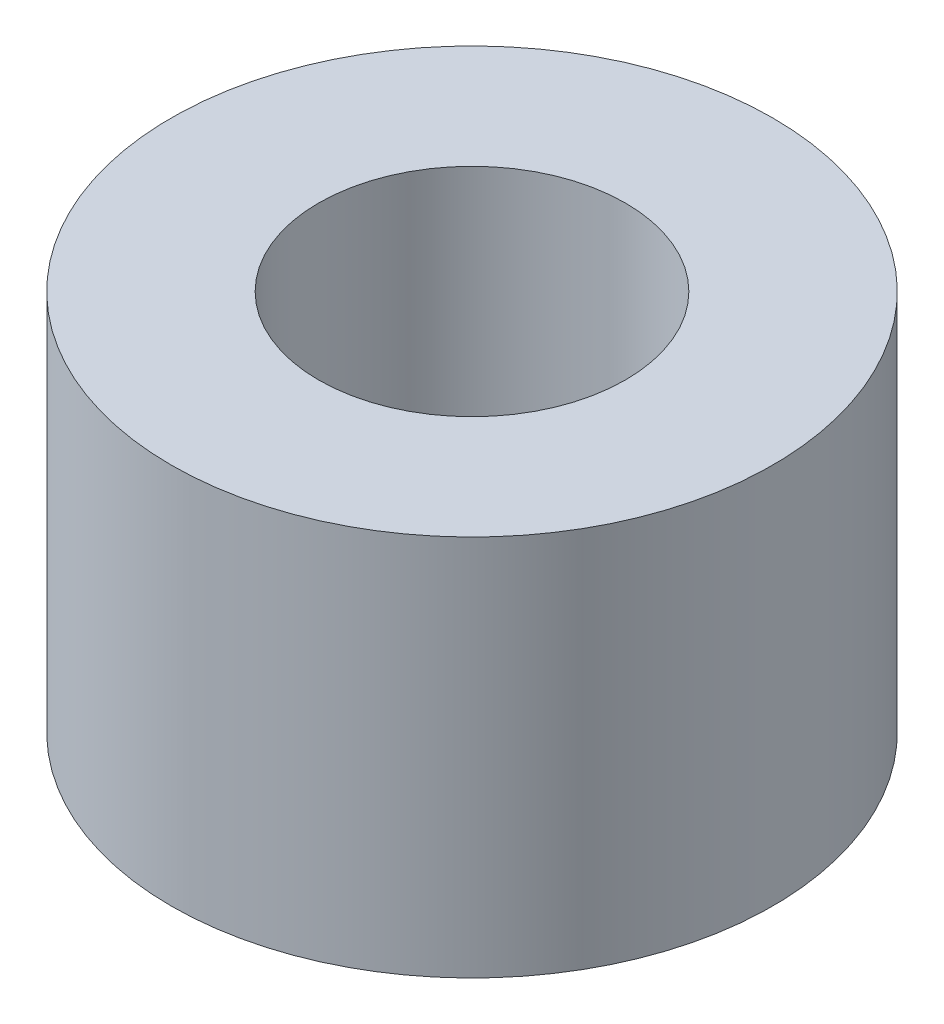
ISO-10303-21;
HEADER;
FILE_DESCRIPTION(('STEP AP214'),'2;1');
FILE_NAME('part.step','',(''),(''),'','','');
FILE_SCHEMA(('AUTOMOTIVE_DESIGN { 1 0 10303 214 1 1 1 1 }'));
ENDSEC;
DATA;
#1=APPLICATION_CONTEXT('core data for automotive mechanical design processes');
#2=APPLICATION_PROTOCOL_DEFINITION('international standard','automotive_design',2000,#1);
#3=PRODUCT_CONTEXT('',#1,'mechanical');
#4=PRODUCT('Part','Part','',(#3));
#5=PRODUCT_RELATED_PRODUCT_CATEGORY('part','',(#4));
#6=PRODUCT_DEFINITION_FORMATION('','',#4);
#7=PRODUCT_DEFINITION_CONTEXT('part definition',#1,'design');
#8=PRODUCT_DEFINITION('design','',#6,#7);
#9=PRODUCT_DEFINITION_SHAPE('','',#8);
#10=(LENGTH_UNIT() NAMED_UNIT(*) SI_UNIT(.MILLI.,.METRE.));
#11=(NAMED_UNIT(*) PLANE_ANGLE_UNIT() SI_UNIT($,.RADIAN.));
#12=(NAMED_UNIT(*) SI_UNIT($,.STERADIAN.) SOLID_ANGLE_UNIT());
#13=UNCERTAINTY_MEASURE_WITH_UNIT(LENGTH_MEASURE(1.E-05),#10,'distance_accuracy_value','');
#14=(GEOMETRIC_REPRESENTATION_CONTEXT(3) GLOBAL_UNCERTAINTY_ASSIGNED_CONTEXT((#13)) GLOBAL_UNIT_ASSIGNED_CONTEXT((#10,
#11,#12)) REPRESENTATION_CONTEXT('',''));
#15=CARTESIAN_POINT('',(0.,0.,0.));
#16=DIRECTION('',(0.,0.,1.));
#17=DIRECTION('',(1.,0.,0.));
#18=AXIS2_PLACEMENT_3D('',#15,#16,#17);
#19=CARTESIAN_POINT('',(0.,6.35,0.));
#20=DIRECTION('',(0.,1.,0.));
#21=DIRECTION('',(0.,0.,1.));
#22=AXIS2_PLACEMENT_3D('',#19,#20,#21);
#23=PLANE('',#22);
#24=CARTESIAN_POINT('',(0.,6.35,0.));
#25=DIRECTION('',(0.,1.,0.));
#26=DIRECTION('',(0.,0.,1.));
#27=AXIS2_PLACEMENT_3D('',#24,#25,#26);
#28=CIRCLE('',#27,5.);
#29=CARTESIAN_POINT('',(0.,6.35,5.));
#30=VERTEX_POINT('',#29);
#31=EDGE_CURVE('E10',#30,#30,#28,.T.);
#32=ORIENTED_EDGE('',*,*,#31,.T.);
#33=EDGE_LOOP('',(#32));
#34=FACE_BOUND('',#33,.T.);
#35=CARTESIAN_POINT('',(0.,6.35,0.));
#36=DIRECTION('',(0.,1.,0.));
#37=DIRECTION('',(0.,0.,1.));
#38=AXIS2_PLACEMENT_3D('',#35,#36,#37);
#39=CIRCLE('',#38,2.55);
#40=CARTESIAN_POINT('',(0.,6.35,2.55));
#41=VERTEX_POINT('',#40);
#42=EDGE_CURVE('E42',#41,#41,#39,.T.);
#43=ORIENTED_EDGE('',*,*,#42,.F.);
#44=EDGE_LOOP('',(#43));
#45=FACE_BOUND('',#44,.T.);
#46=ADVANCED_FACE('F31',(#34,#45),#23,.T.);
#47=CARTESIAN_POINT('',(0.,0.,0.));
#48=DIRECTION('',(0.,1.,0.));
#49=DIRECTION('',(0.,0.,1.));
#50=AXIS2_PLACEMENT_3D('',#47,#48,#49);
#51=PLANE('',#50);
#52=CARTESIAN_POINT('',(0.,0.,0.));
#53=DIRECTION('',(0.,1.,0.));
#54=DIRECTION('',(0.,0.,1.));
#55=AXIS2_PLACEMENT_3D('',#52,#53,#54);
#56=CIRCLE('',#55,5.);
#57=CARTESIAN_POINT('',(0.,0.,5.));
#58=VERTEX_POINT('',#57);
#59=EDGE_CURVE('E35',#58,#58,#56,.T.);
#60=ORIENTED_EDGE('',*,*,#59,.F.);
#61=EDGE_LOOP('',(#60));
#62=FACE_BOUND('',#61,.T.);
#63=CARTESIAN_POINT('',(0.,0.,0.));
#64=DIRECTION('',(0.,1.,0.));
#65=DIRECTION('',(0.,0.,1.));
#66=AXIS2_PLACEMENT_3D('',#63,#64,#65);
#67=CIRCLE('',#66,2.55);
#68=CARTESIAN_POINT('',(0.,0.,2.55));
#69=VERTEX_POINT('',#68);
#70=EDGE_CURVE('E44',#69,#69,#67,.T.);
#71=ORIENTED_EDGE('',*,*,#70,.T.);
#72=EDGE_LOOP('',(#71));
#73=FACE_BOUND('',#72,.T.);
#74=ADVANCED_FACE('F54',(#62,#73),#51,.F.);
#75=CARTESIAN_POINT('',(0.,6.35,0.));
#76=DIRECTION('',(0.,-1.,0.));
#77=DIRECTION('',(0.,0.,-1.));
#78=AXIS2_PLACEMENT_3D('',#75,#76,#77);
#79=CYLINDRICAL_SURFACE('',#78,5.);
#80=ORIENTED_EDGE('',*,*,#31,.F.);
#81=EDGE_LOOP('',(#80));
#82=FACE_BOUND('',#81,.T.);
#83=ORIENTED_EDGE('',*,*,#59,.T.);
#84=EDGE_LOOP('',(#83));
#85=FACE_BOUND('',#84,.T.);
#86=ADVANCED_FACE('F33',(#82,#85),#79,.T.);
#87=CARTESIAN_POINT('',(0.,6.35,0.));
#88=DIRECTION('',(0.,-1.,0.));
#89=DIRECTION('',(0.,0.,-1.));
#90=AXIS2_PLACEMENT_3D('',#87,#88,#89);
#91=CYLINDRICAL_SURFACE('',#90,2.55);
#92=ORIENTED_EDGE('',*,*,#42,.T.);
#93=EDGE_LOOP('',(#92));
#94=FACE_BOUND('',#93,.T.);
#95=ORIENTED_EDGE('',*,*,#70,.F.);
#96=EDGE_LOOP('',(#95));
#97=FACE_BOUND('',#96,.T.);
#98=ADVANCED_FACE('F50',(#94,#97),#91,.F.);
#99=CLOSED_SHELL('',(#46,#74,#86,#98));
#100=MANIFOLD_SOLID_BREP('B2',#99);
#101=ADVANCED_BREP_SHAPE_REPRESENTATION('',(#18,#100),#14);
#102=SHAPE_DEFINITION_REPRESENTATION(#9,#101);
ENDSEC;
END-ISO-10303-21;
